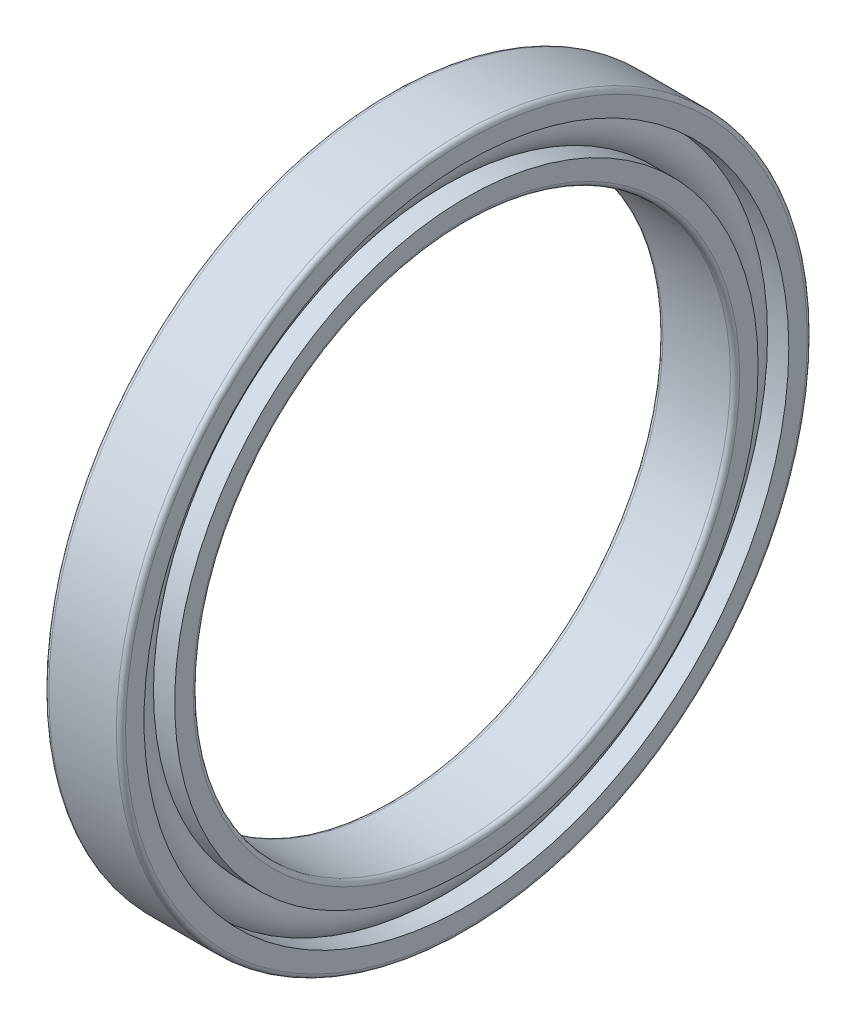
ISO-10303-21;
HEADER;
FILE_DESCRIPTION(('STEP AP214'),'2;1');
FILE_NAME('part.step','',(''),(''),'','','');
FILE_SCHEMA(('AUTOMOTIVE_DESIGN { 1 0 10303 214 1 1 1 1 }'));
ENDSEC;
DATA;
#1=APPLICATION_CONTEXT('core data for automotive mechanical design processes');
#2=APPLICATION_PROTOCOL_DEFINITION('international standard','automotive_design',2000,#1);
#3=PRODUCT_CONTEXT('',#1,'mechanical');
#4=PRODUCT('Part','Part','',(#3));
#5=PRODUCT_RELATED_PRODUCT_CATEGORY('part','',(#4));
#6=PRODUCT_DEFINITION_FORMATION('','',#4);
#7=PRODUCT_DEFINITION_CONTEXT('part definition',#1,'design');
#8=PRODUCT_DEFINITION('design','',#6,#7);
#9=PRODUCT_DEFINITION_SHAPE('','',#8);
#10=(LENGTH_UNIT() NAMED_UNIT(*) SI_UNIT(.MILLI.,.METRE.));
#11=(NAMED_UNIT(*) PLANE_ANGLE_UNIT() SI_UNIT($,.RADIAN.));
#12=(NAMED_UNIT(*) SI_UNIT($,.STERADIAN.) SOLID_ANGLE_UNIT());
#13=UNCERTAINTY_MEASURE_WITH_UNIT(LENGTH_MEASURE(1.E-05),#10,'distance_accuracy_value','');
#14=(GEOMETRIC_REPRESENTATION_CONTEXT(3) GLOBAL_UNCERTAINTY_ASSIGNED_CONTEXT((#13)) GLOBAL_UNIT_ASSIGNED_CONTEXT((#10,
#11,#12)) REPRESENTATION_CONTEXT('',''));
#15=CARTESIAN_POINT('',(0.,0.,0.));
#16=DIRECTION('',(0.,0.,1.));
#17=DIRECTION('',(1.,0.,0.));
#18=AXIS2_PLACEMENT_3D('',#15,#16,#17);
#19=CARTESIAN_POINT('',(0.,0.,0.));
#20=DIRECTION('',(-1.,0.,0.));
#21=DIRECTION('',(0.,0.,1.));
#22=AXIS2_PLACEMENT_3D('',#19,#20,#21);
#23=TOROIDAL_SURFACE('',#22,40.,3.);
#24=CARTESIAN_POINT('',(2.23606797749978,0.,0.));
#25=DIRECTION('',(-1.,0.,0.));
#26=DIRECTION('',(0.,0.,1.));
#27=AXIS2_PLACEMENT_3D('',#24,#25,#26);
#28=CIRCLE('',#27,42.);
#29=CARTESIAN_POINT('',(2.23606797749978,0.,42.));
#30=VERTEX_POINT('',#29);
#31=EDGE_CURVE('E36',#30,#30,#28,.F.);
#32=ORIENTED_EDGE('',*,*,#31,.T.);
#33=EDGE_LOOP('',(#32));
#34=FACE_BOUND('',#33,.T.);
#35=CARTESIAN_POINT('',(2.23606797749978,0.,0.));
#36=DIRECTION('',(-1.,0.,0.));
#37=DIRECTION('',(0.,0.,1.));
#38=AXIS2_PLACEMENT_3D('',#35,#36,#37);
#39=CIRCLE('',#38,38.);
#40=CARTESIAN_POINT('',(2.23606797749978,0.,38.));
#41=VERTEX_POINT('',#40);
#42=EDGE_CURVE('E10',#41,#41,#39,.T.);
#43=ORIENTED_EDGE('',*,*,#42,.T.);
#44=EDGE_LOOP('',(#43));
#45=FACE_BOUND('',#44,.T.);
#46=ADVANCED_FACE('F32',(#34,#45),#23,.T.);
#47=CARTESIAN_POINT('',(-20.6375,0.,0.));
#48=DIRECTION('',(1.,0.,0.));
#49=DIRECTION('',(0.,0.,-1.));
#50=AXIS2_PLACEMENT_3D('',#47,#48,#49);
#51=CYLINDRICAL_SURFACE('',#50,38.);
#52=CARTESIAN_POINT('',(5.,0.,0.));
#53=DIRECTION('',(1.,0.,0.));
#54=DIRECTION('',(0.,0.,-1.));
#55=AXIS2_PLACEMENT_3D('',#52,#53,#54);
#56=CIRCLE('',#55,38.);
#57=CARTESIAN_POINT('',(5.,0.,-38.));
#58=VERTEX_POINT('',#57);
#59=EDGE_CURVE('E45',#58,#58,#56,.T.);
#60=ORIENTED_EDGE('',*,*,#59,.F.);
#61=EDGE_LOOP('',(#60));
#62=FACE_BOUND('',#61,.T.);
#63=ORIENTED_EDGE('',*,*,#42,.F.);
#64=EDGE_LOOP('',(#63));
#65=FACE_BOUND('',#64,.T.);
#66=ADVANCED_FACE('F84',(#62,#65),#51,.T.);
#67=CARTESIAN_POINT('',(-20.6375,0.,0.));
#68=DIRECTION('',(1.,0.,0.));
#69=DIRECTION('',(0.,0.,-1.));
#70=AXIS2_PLACEMENT_3D('',#67,#68,#69);
#71=CYLINDRICAL_SURFACE('',#70,38.);
#72=CARTESIAN_POINT('',(-5.,0.,0.));
#73=DIRECTION('',(1.,0.,0.));
#74=DIRECTION('',(0.,0.,-1.));
#75=AXIS2_PLACEMENT_3D('',#72,#73,#74);
#76=CIRCLE('',#75,38.);
#77=CARTESIAN_POINT('',(-5.,0.,-38.));
#78=VERTEX_POINT('',#77);
#79=EDGE_CURVE('E54',#78,#78,#76,.T.);
#80=ORIENTED_EDGE('',*,*,#79,.T.);
#81=EDGE_LOOP('',(#80));
#82=FACE_BOUND('',#81,.T.);
#83=CARTESIAN_POINT('',(-2.23606797749978,0.,0.));
#84=DIRECTION('',(1.,0.,0.));
#85=DIRECTION('',(0.,0.,-1.));
#86=AXIS2_PLACEMENT_3D('',#83,#84,#85);
#87=CIRCLE('',#86,38.);
#88=CARTESIAN_POINT('',(-2.23606797749978,0.,-38.));
#89=VERTEX_POINT('',#88);
#90=EDGE_CURVE('E40',#89,#89,#87,.T.);
#91=ORIENTED_EDGE('',*,*,#90,.F.);
#92=EDGE_LOOP('',(#91));
#93=FACE_BOUND('',#92,.T.);
#94=ADVANCED_FACE('F87',(#82,#93),#71,.T.);
#95=CARTESIAN_POINT('',(5.,35.6,0.));
#96=DIRECTION('',(1.,0.,0.));
#97=DIRECTION('',(0.,0.,-1.));
#98=AXIS2_PLACEMENT_3D('',#95,#96,#97);
#99=PLANE('',#98);
#100=ORIENTED_EDGE('',*,*,#59,.T.);
#101=EDGE_LOOP('',(#100));
#102=FACE_BOUND('',#101,.T.);
#103=CARTESIAN_POINT('',(5.,0.,0.));
#104=DIRECTION('',(1.,0.,0.));
#105=DIRECTION('',(0.,0.,-1.));
#106=AXIS2_PLACEMENT_3D('',#103,#104,#105);
#107=CIRCLE('',#106,35.6);
#108=CARTESIAN_POINT('',(5.,0.,-35.6));
#109=VERTEX_POINT('',#108);
#110=EDGE_CURVE('E76',#109,#109,#107,.T.);
#111=ORIENTED_EDGE('',*,*,#110,.F.);
#112=EDGE_LOOP('',(#111));
#113=FACE_BOUND('',#112,.T.);
#114=ADVANCED_FACE('F81',(#102,#113),#99,.T.);
#115=CARTESIAN_POINT('',(4.4,0.,0.));
#116=DIRECTION('',(1.,0.,0.));
#117=DIRECTION('',(0.,0.,-1.));
#118=AXIS2_PLACEMENT_3D('',#115,#116,#117);
#119=TOROIDAL_SURFACE('',#118,35.6,0.599999999999998);
#120=ORIENTED_EDGE('',*,*,#110,.T.);
#121=EDGE_LOOP('',(#120));
#122=FACE_BOUND('',#121,.T.);
#123=CARTESIAN_POINT('',(4.4,0.,0.));
#124=DIRECTION('',(1.,0.,0.));
#125=DIRECTION('',(0.,0.,-1.));
#126=AXIS2_PLACEMENT_3D('',#123,#124,#125);
#127=CIRCLE('',#126,35.);
#128=CARTESIAN_POINT('',(4.4,0.,-35.));
#129=VERTEX_POINT('',#128);
#130=EDGE_CURVE('E73',#129,#129,#127,.T.);
#131=ORIENTED_EDGE('',*,*,#130,.F.);
#132=EDGE_LOOP('',(#131));
#133=FACE_BOUND('',#132,.T.);
#134=ADVANCED_FACE('F98',(#122,#133),#119,.T.);
#135=CARTESIAN_POINT('',(-20.6375,0.,0.));
#136=DIRECTION('',(1.,0.,0.));
#137=DIRECTION('',(0.,0.,-1.));
#138=AXIS2_PLACEMENT_3D('',#135,#136,#137);
#139=CYLINDRICAL_SURFACE('',#138,35.);
#140=ORIENTED_EDGE('',*,*,#130,.T.);
#141=EDGE_LOOP('',(#140));
#142=FACE_BOUND('',#141,.T.);
#143=CARTESIAN_POINT('',(-4.4,0.,0.));
#144=DIRECTION('',(1.,0.,0.));
#145=DIRECTION('',(0.,0.,-1.));
#146=AXIS2_PLACEMENT_3D('',#143,#144,#145);
#147=CIRCLE('',#146,35.);
#148=CARTESIAN_POINT('',(-4.4,0.,-35.));
#149=VERTEX_POINT('',#148);
#150=EDGE_CURVE('E70',#149,#149,#147,.T.);
#151=ORIENTED_EDGE('',*,*,#150,.F.);
#152=EDGE_LOOP('',(#151));
#153=FACE_BOUND('',#152,.T.);
#154=ADVANCED_FACE('F101',(#142,#153),#139,.F.);
#155=CARTESIAN_POINT('',(-4.4,0.,0.));
#156=DIRECTION('',(1.,0.,0.));
#157=DIRECTION('',(0.,0.,-1.));
#158=AXIS2_PLACEMENT_3D('',#155,#156,#157);
#159=TOROIDAL_SURFACE('',#158,35.6,0.599999999999998);
#160=ORIENTED_EDGE('',*,*,#150,.T.);
#161=EDGE_LOOP('',(#160));
#162=FACE_BOUND('',#161,.T.);
#163=CARTESIAN_POINT('',(-5.,0.,0.));
#164=DIRECTION('',(1.,0.,0.));
#165=DIRECTION('',(0.,0.,-1.));
#166=AXIS2_PLACEMENT_3D('',#163,#164,#165);
#167=CIRCLE('',#166,35.6);
#168=CARTESIAN_POINT('',(-5.,0.,-35.6));
#169=VERTEX_POINT('',#168);
#170=EDGE_CURVE('E67',#169,#169,#167,.T.);
#171=ORIENTED_EDGE('',*,*,#170,.F.);
#172=EDGE_LOOP('',(#171));
#173=FACE_BOUND('',#172,.T.);
#174=ADVANCED_FACE('F105',(#162,#173),#159,.T.);
#175=CARTESIAN_POINT('',(-5.,38.,0.));
#176=DIRECTION('',(-1.,0.,0.));
#177=DIRECTION('',(0.,0.,1.));
#178=AXIS2_PLACEMENT_3D('',#175,#176,#177);
#179=PLANE('',#178);
#180=ORIENTED_EDGE('',*,*,#170,.T.);
#181=EDGE_LOOP('',(#180));
#182=FACE_BOUND('',#181,.T.);
#183=ORIENTED_EDGE('',*,*,#79,.F.);
#184=EDGE_LOOP('',(#183));
#185=FACE_BOUND('',#184,.T.);
#186=ADVANCED_FACE('F109',(#182,#185),#179,.T.);
#187=CARTESIAN_POINT('',(-2.23606797749978,0.,0.));
#188=DIRECTION('',(1.,0.,0.));
#189=DIRECTION('',(0.,0.,-1.));
#190=AXIS2_PLACEMENT_3D('',#187,#188,#189);
#191=CIRCLE('',#190,42.);
#192=CARTESIAN_POINT('',(-2.23606797749978,0.,-42.));
#193=VERTEX_POINT('',#192);
#194=EDGE_CURVE('E48',#193,#193,#191,.F.);
#195=ORIENTED_EDGE('',*,*,#194,.T.);
#196=EDGE_LOOP('',(#195));
#197=FACE_BOUND('',#196,.T.);
#198=ORIENTED_EDGE('',*,*,#90,.T.);
#199=EDGE_LOOP('',(#198));
#200=FACE_BOUND('',#199,.T.);
#201=ADVANCED_FACE('F34',(#197,#200),#23,.T.);
#202=CARTESIAN_POINT('',(-20.6375,0.,0.));
#203=DIRECTION('',(1.,0.,0.));
#204=DIRECTION('',(0.,0.,-1.));
#205=AXIS2_PLACEMENT_3D('',#202,#203,#204);
#206=CYLINDRICAL_SURFACE('',#205,42.);
#207=CARTESIAN_POINT('',(5.,0.,0.));
#208=DIRECTION('',(1.,0.,0.));
#209=DIRECTION('',(0.,0.,-1.));
#210=AXIS2_PLACEMENT_3D('',#207,#208,#209);
#211=CIRCLE('',#210,42.);
#212=CARTESIAN_POINT('',(5.,0.,-42.));
#213=VERTEX_POINT('',#212);
#214=EDGE_CURVE('E50',#213,#213,#211,.T.);
#215=ORIENTED_EDGE('',*,*,#214,.T.);
#216=EDGE_LOOP('',(#215));
#217=FACE_BOUND('',#216,.T.);
#218=ORIENTED_EDGE('',*,*,#31,.F.);
#219=EDGE_LOOP('',(#218));
#220=FACE_BOUND('',#219,.T.);
#221=ADVANCED_FACE('F114',(#217,#220),#206,.F.);
#222=CARTESIAN_POINT('',(-20.6375,0.,0.));
#223=DIRECTION('',(1.,0.,0.));
#224=DIRECTION('',(0.,0.,-1.));
#225=AXIS2_PLACEMENT_3D('',#222,#223,#224);
#226=CYLINDRICAL_SURFACE('',#225,42.);
#227=CARTESIAN_POINT('',(-5.,0.,0.));
#228=DIRECTION('',(1.,0.,0.));
#229=DIRECTION('',(0.,0.,-1.));
#230=AXIS2_PLACEMENT_3D('',#227,#228,#229);
#231=CIRCLE('',#230,42.);
#232=CARTESIAN_POINT('',(-5.,0.,-42.));
#233=VERTEX_POINT('',#232);
#234=EDGE_CURVE('E145',#233,#233,#231,.T.);
#235=ORIENTED_EDGE('',*,*,#234,.F.);
#236=EDGE_LOOP('',(#235));
#237=FACE_BOUND('',#236,.T.);
#238=ORIENTED_EDGE('',*,*,#194,.F.);
#239=EDGE_LOOP('',(#238));
#240=FACE_BOUND('',#239,.T.);
#241=ADVANCED_FACE('F117',(#237,#240),#226,.F.);
#242=CARTESIAN_POINT('',(5.,44.4,0.));
#243=DIRECTION('',(1.,0.,0.));
#244=DIRECTION('',(0.,0.,-1.));
#245=AXIS2_PLACEMENT_3D('',#242,#243,#244);
#246=PLANE('',#245);
#247=CARTESIAN_POINT('',(5.,0.,0.));
#248=DIRECTION('',(1.,0.,0.));
#249=DIRECTION('',(0.,0.,-1.));
#250=AXIS2_PLACEMENT_3D('',#247,#248,#249);
#251=CIRCLE('',#250,44.4);
#252=CARTESIAN_POINT('',(5.,0.,-44.4));
#253=VERTEX_POINT('',#252);
#254=EDGE_CURVE('E56',#253,#253,#251,.T.);
#255=ORIENTED_EDGE('',*,*,#254,.T.);
#256=EDGE_LOOP('',(#255));
#257=FACE_BOUND('',#256,.T.);
#258=ORIENTED_EDGE('',*,*,#214,.F.);
#259=EDGE_LOOP('',(#258));
#260=FACE_BOUND('',#259,.T.);
#261=ADVANCED_FACE('F118',(#257,#260),#246,.T.);
#262=CARTESIAN_POINT('',(4.4,0.,0.));
#263=DIRECTION('',(1.,0.,0.));
#264=DIRECTION('',(0.,0.,-1.));
#265=AXIS2_PLACEMENT_3D('',#262,#263,#264);
#266=TOROIDAL_SURFACE('',#265,44.4,0.599999999999999);
#267=CARTESIAN_POINT('',(4.4,0.,0.));
#268=DIRECTION('',(1.,0.,0.));
#269=DIRECTION('',(0.,0.,-1.));
#270=AXIS2_PLACEMENT_3D('',#267,#268,#269);
#271=CIRCLE('',#270,45.);
#272=CARTESIAN_POINT('',(4.4,0.,-45.));
#273=VERTEX_POINT('',#272);
#274=EDGE_CURVE('E61',#273,#273,#271,.T.);
#275=ORIENTED_EDGE('',*,*,#274,.T.);
#276=EDGE_LOOP('',(#275));
#277=FACE_BOUND('',#276,.T.);
#278=ORIENTED_EDGE('',*,*,#254,.F.);
#279=EDGE_LOOP('',(#278));
#280=FACE_BOUND('',#279,.T.);
#281=ADVANCED_FACE('F121',(#277,#280),#266,.T.);
#282=CARTESIAN_POINT('',(-20.6375,0.,0.));
#283=DIRECTION('',(1.,0.,0.));
#284=DIRECTION('',(0.,0.,-1.));
#285=AXIS2_PLACEMENT_3D('',#282,#283,#284);
#286=CYLINDRICAL_SURFACE('',#285,45.);
#287=CARTESIAN_POINT('',(-4.4,0.,0.));
#288=DIRECTION('',(1.,0.,0.));
#289=DIRECTION('',(0.,0.,-1.));
#290=AXIS2_PLACEMENT_3D('',#287,#288,#289);
#291=CIRCLE('',#290,45.);
#292=CARTESIAN_POINT('',(-4.4,0.,-45.));
#293=VERTEX_POINT('',#292);
#294=EDGE_CURVE('E149',#293,#293,#291,.T.);
#295=ORIENTED_EDGE('',*,*,#294,.T.);
#296=EDGE_LOOP('',(#295));
#297=FACE_BOUND('',#296,.T.);
#298=ORIENTED_EDGE('',*,*,#274,.F.);
#299=EDGE_LOOP('',(#298));
#300=FACE_BOUND('',#299,.T.);
#301=ADVANCED_FACE('F125',(#297,#300),#286,.T.);
#302=CARTESIAN_POINT('',(-4.4,0.,0.));
#303=DIRECTION('',(1.,0.,0.));
#304=DIRECTION('',(0.,0.,-1.));
#305=AXIS2_PLACEMENT_3D('',#302,#303,#304);
#306=TOROIDAL_SURFACE('',#305,44.4,0.599999999999999);
#307=CARTESIAN_POINT('',(-5.,0.,0.));
#308=DIRECTION('',(1.,0.,0.));
#309=DIRECTION('',(0.,0.,-1.));
#310=AXIS2_PLACEMENT_3D('',#307,#308,#309);
#311=CIRCLE('',#310,44.4);
#312=CARTESIAN_POINT('',(-5.,0.,-44.4));
#313=VERTEX_POINT('',#312);
#314=EDGE_CURVE('E146',#313,#313,#311,.T.);
#315=ORIENTED_EDGE('',*,*,#314,.T.);
#316=EDGE_LOOP('',(#315));
#317=FACE_BOUND('',#316,.T.);
#318=ORIENTED_EDGE('',*,*,#294,.F.);
#319=EDGE_LOOP('',(#318));
#320=FACE_BOUND('',#319,.T.);
#321=ADVANCED_FACE('F129',(#317,#320),#306,.T.);
#322=CARTESIAN_POINT('',(-5.,42.,0.));
#323=DIRECTION('',(-1.,0.,0.));
#324=DIRECTION('',(0.,0.,1.));
#325=AXIS2_PLACEMENT_3D('',#322,#323,#324);
#326=PLANE('',#325);
#327=ORIENTED_EDGE('',*,*,#234,.T.);
#328=EDGE_LOOP('',(#327));
#329=FACE_BOUND('',#328,.T.);
#330=ORIENTED_EDGE('',*,*,#314,.F.);
#331=EDGE_LOOP('',(#330));
#332=FACE_BOUND('',#331,.T.);
#333=ADVANCED_FACE('F133',(#329,#332),#326,.T.);
#334=CLOSED_SHELL('',(#46,#66,#94,#114,#134,#154,#174,#186,#201,#221,#241,#261,#281,#301,#321,#333));
#335=MANIFOLD_SOLID_BREP('B2',#334);
#336=ADVANCED_BREP_SHAPE_REPRESENTATION('',(#18,#335),#14);
#337=SHAPE_DEFINITION_REPRESENTATION(#9,#336);
ENDSEC;
END-ISO-10303-21;
